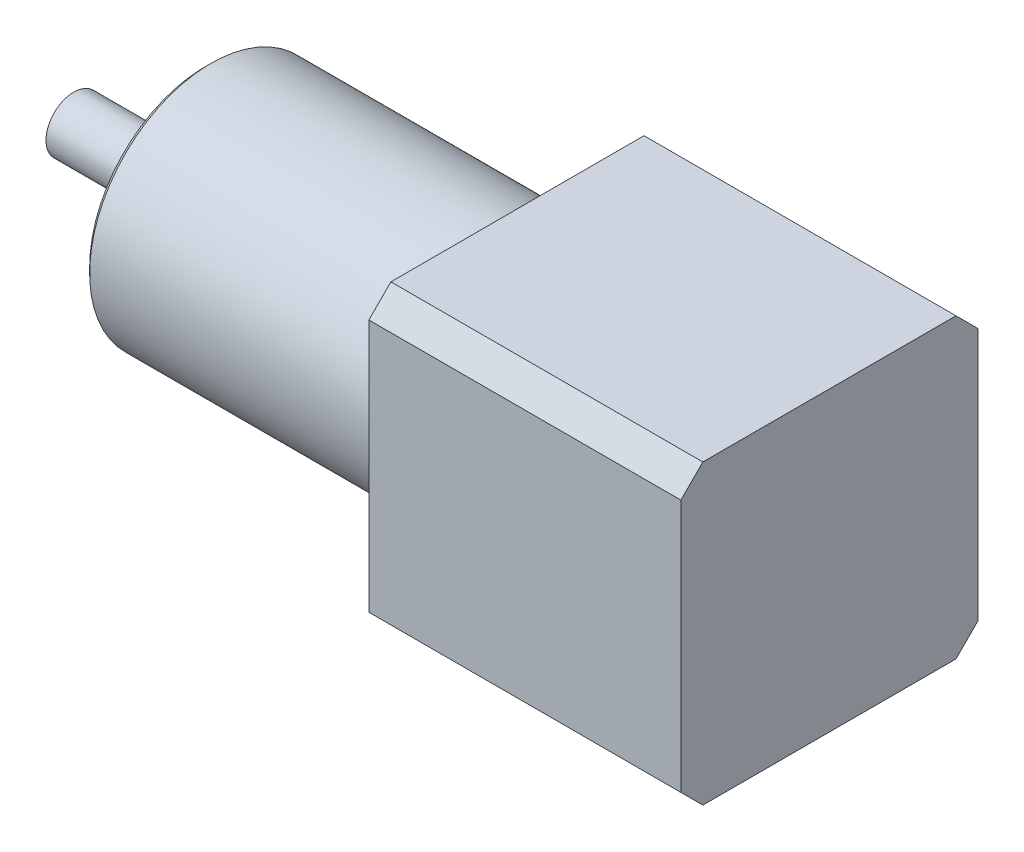
ISO-10303-21;
HEADER;
FILE_DESCRIPTION(('STEP AP214'),'2;1');
FILE_NAME('part.step','',(''),(''),'','','');
FILE_SCHEMA(('AUTOMOTIVE_DESIGN { 1 0 10303 214 1 1 1 1 }'));
ENDSEC;
DATA;
#1=APPLICATION_CONTEXT('core data for automotive mechanical design processes');
#2=APPLICATION_PROTOCOL_DEFINITION('international standard','automotive_design',2000,#1);
#3=PRODUCT_CONTEXT('',#1,'mechanical');
#4=PRODUCT('Part','Part','',(#3));
#5=PRODUCT_RELATED_PRODUCT_CATEGORY('part','',(#4));
#6=PRODUCT_DEFINITION_FORMATION('','',#4);
#7=PRODUCT_DEFINITION_CONTEXT('part definition',#1,'design');
#8=PRODUCT_DEFINITION('design','',#6,#7);
#9=PRODUCT_DEFINITION_SHAPE('','',#8);
#10=(LENGTH_UNIT() NAMED_UNIT(*) SI_UNIT(.MILLI.,.METRE.));
#11=(NAMED_UNIT(*) PLANE_ANGLE_UNIT() SI_UNIT($,.RADIAN.));
#12=(NAMED_UNIT(*) SI_UNIT($,.STERADIAN.) SOLID_ANGLE_UNIT());
#13=UNCERTAINTY_MEASURE_WITH_UNIT(LENGTH_MEASURE(1.E-05),#10,'distance_accuracy_value','');
#14=(GEOMETRIC_REPRESENTATION_CONTEXT(3) GLOBAL_UNCERTAINTY_ASSIGNED_CONTEXT((#13)) GLOBAL_UNIT_ASSIGNED_CONTEXT((#10,
#11,#12)) REPRESENTATION_CONTEXT('',''));
#15=CARTESIAN_POINT('',(0.,0.,0.));
#16=DIRECTION('',(0.,0.,1.));
#17=DIRECTION('',(1.,0.,0.));
#18=AXIS2_PLACEMENT_3D('',#15,#16,#17);
#19=CARTESIAN_POINT('',(-45.,-21.43125,-21.43125));
#20=DIRECTION('',(0.,0.,-1.));
#21=DIRECTION('',(-1.,0.,0.));
#22=AXIS2_PLACEMENT_3D('',#19,#20,#21);
#23=PLANE('',#22);
#24=DIRECTION('',(0.,1.,0.));
#25=VECTOR('',#24,1.);
#26=CARTESIAN_POINT('',(-45.,-21.43125,-21.43125));
#27=LINE('',#26,#25);
#28=CARTESIAN_POINT('',(-45.,-18.25625,-21.43125));
#29=VERTEX_POINT('',#28);
#30=CARTESIAN_POINT('',(-45.,18.25625,-21.43125));
#31=VERTEX_POINT('',#30);
#32=EDGE_CURVE('E226',#29,#31,#27,.T.);
#33=ORIENTED_EDGE('',*,*,#32,.T.);
#34=DIRECTION('',(1.,0.,0.));
#35=VECTOR('',#34,1.);
#36=CARTESIAN_POINT('',(-45.,18.25625,-21.43125));
#37=LINE('',#36,#35);
#38=CARTESIAN_POINT('',(0.,18.25625,-21.43125));
#39=VERTEX_POINT('',#38);
#40=EDGE_CURVE('E177',#31,#39,#37,.T.);
#41=ORIENTED_EDGE('',*,*,#40,.T.);
#42=DIRECTION('',(0.,1.,0.));
#43=VECTOR('',#42,1.);
#44=CARTESIAN_POINT('',(0.,-21.43125,-21.43125));
#45=LINE('',#44,#43);
#46=CARTESIAN_POINT('',(0.,-18.25625,-21.43125));
#47=VERTEX_POINT('',#46);
#48=EDGE_CURVE('E247',#47,#39,#45,.T.);
#49=ORIENTED_EDGE('',*,*,#48,.F.);
#50=DIRECTION('',(-1.,0.,0.));
#51=VECTOR('',#50,1.);
#52=CARTESIAN_POINT('',(-45.,-18.25625,-21.43125));
#53=LINE('',#52,#51);
#54=EDGE_CURVE('E174',#47,#29,#53,.T.);
#55=ORIENTED_EDGE('',*,*,#54,.T.);
#56=EDGE_LOOP('',(#33,#41,#49,#55));
#57=FACE_BOUND('',#56,.T.);
#58=ADVANCED_FACE('F41',(#57),#23,.T.);
#59=CARTESIAN_POINT('',(-45.,-21.43125,21.43125));
#60=DIRECTION('',(0.,-1.,0.));
#61=DIRECTION('',(0.,0.,-1.));
#62=AXIS2_PLACEMENT_3D('',#59,#60,#61);
#63=PLANE('',#62);
#64=DIRECTION('',(0.,0.,-1.));
#65=VECTOR('',#64,1.);
#66=CARTESIAN_POINT('',(0.,-21.43125,21.43125));
#67=LINE('',#66,#65);
#68=CARTESIAN_POINT('',(0.,-21.43125,18.25625));
#69=VERTEX_POINT('',#68);
#70=CARTESIAN_POINT('',(0.,-21.43125,-18.25625));
#71=VERTEX_POINT('',#70);
#72=EDGE_CURVE('E130',#69,#71,#67,.T.);
#73=ORIENTED_EDGE('',*,*,#72,.F.);
#74=DIRECTION('',(-1.,0.,0.));
#75=VECTOR('',#74,1.);
#76=CARTESIAN_POINT('',(-45.,-21.43125,18.25625));
#77=LINE('',#76,#75);
#78=CARTESIAN_POINT('',(-45.,-21.43125,18.25625));
#79=VERTEX_POINT('',#78);
#80=EDGE_CURVE('E155',#69,#79,#77,.T.);
#81=ORIENTED_EDGE('',*,*,#80,.T.);
#82=DIRECTION('',(0.,0.,-1.));
#83=VECTOR('',#82,1.);
#84=CARTESIAN_POINT('',(-45.,-21.43125,21.43125));
#85=LINE('',#84,#83);
#86=CARTESIAN_POINT('',(-45.,-21.43125,-18.25625));
#87=VERTEX_POINT('',#86);
#88=EDGE_CURVE('E243',#79,#87,#85,.T.);
#89=ORIENTED_EDGE('',*,*,#88,.T.);
#90=DIRECTION('',(1.,0.,0.));
#91=VECTOR('',#90,1.);
#92=CARTESIAN_POINT('',(-45.,-21.43125,-18.25625));
#93=LINE('',#92,#91);
#94=EDGE_CURVE('E151',#87,#71,#93,.T.);
#95=ORIENTED_EDGE('',*,*,#94,.T.);
#96=EDGE_LOOP('',(#73,#81,#89,#95));
#97=FACE_BOUND('',#96,.T.);
#98=ADVANCED_FACE('F197',(#97),#63,.T.);
#99=CARTESIAN_POINT('',(-45.,-21.43125,21.43125));
#100=DIRECTION('',(0.,0.,1.));
#101=DIRECTION('',(1.,0.,0.));
#102=AXIS2_PLACEMENT_3D('',#99,#100,#101);
#103=PLANE('',#102);
#104=DIRECTION('',(0.,-1.,0.));
#105=VECTOR('',#104,1.);
#106=CARTESIAN_POINT('',(-45.,-21.43125,21.43125));
#107=LINE('',#106,#105);
#108=CARTESIAN_POINT('',(-45.,18.25625,21.43125));
#109=VERTEX_POINT('',#108);
#110=CARTESIAN_POINT('',(-45.,-18.25625,21.43125));
#111=VERTEX_POINT('',#110);
#112=EDGE_CURVE('E236',#109,#111,#107,.T.);
#113=ORIENTED_EDGE('',*,*,#112,.T.);
#114=DIRECTION('',(1.,0.,0.));
#115=VECTOR('',#114,1.);
#116=CARTESIAN_POINT('',(-45.,-18.25625,21.43125));
#117=LINE('',#116,#115);
#118=CARTESIAN_POINT('',(0.,-18.25625,21.43125));
#119=VERTEX_POINT('',#118);
#120=EDGE_CURVE('E128',#111,#119,#117,.T.);
#121=ORIENTED_EDGE('',*,*,#120,.T.);
#122=DIRECTION('',(0.,-1.,0.));
#123=VECTOR('',#122,1.);
#124=CARTESIAN_POINT('',(0.,-21.43125,21.43125));
#125=LINE('',#124,#123);
#126=CARTESIAN_POINT('',(0.,18.25625,21.43125));
#127=VERTEX_POINT('',#126);
#128=EDGE_CURVE('E112',#127,#119,#125,.T.);
#129=ORIENTED_EDGE('',*,*,#128,.F.);
#130=DIRECTION('',(-1.,0.,0.));
#131=VECTOR('',#130,1.);
#132=CARTESIAN_POINT('',(-45.,18.25625,21.43125));
#133=LINE('',#132,#131);
#134=EDGE_CURVE('E126',#127,#109,#133,.T.);
#135=ORIENTED_EDGE('',*,*,#134,.T.);
#136=EDGE_LOOP('',(#113,#121,#129,#135));
#137=FACE_BOUND('',#136,.T.);
#138=ADVANCED_FACE('F125',(#137),#103,.T.);
#139=CARTESIAN_POINT('',(-45.,21.43125,21.43125));
#140=DIRECTION('',(0.,1.,0.));
#141=DIRECTION('',(0.,0.,1.));
#142=AXIS2_PLACEMENT_3D('',#139,#140,#141);
#143=PLANE('',#142);
#144=DIRECTION('',(0.,0.,1.));
#145=VECTOR('',#144,1.);
#146=CARTESIAN_POINT('',(-45.,21.43125,21.43125));
#147=LINE('',#146,#145);
#148=CARTESIAN_POINT('',(-45.,21.43125,-18.25625));
#149=VERTEX_POINT('',#148);
#150=CARTESIAN_POINT('',(-45.,21.43125,18.25625));
#151=VERTEX_POINT('',#150);
#152=EDGE_CURVE('E228',#149,#151,#147,.T.);
#153=ORIENTED_EDGE('',*,*,#152,.T.);
#154=DIRECTION('',(1.,0.,0.));
#155=VECTOR('',#154,1.);
#156=CARTESIAN_POINT('',(-45.,21.43125,18.25625));
#157=LINE('',#156,#155);
#158=CARTESIAN_POINT('',(0.,21.43125,18.25625));
#159=VERTEX_POINT('',#158);
#160=EDGE_CURVE('E171',#151,#159,#157,.T.);
#161=ORIENTED_EDGE('',*,*,#160,.T.);
#162=DIRECTION('',(0.,0.,1.));
#163=VECTOR('',#162,1.);
#164=CARTESIAN_POINT('',(0.,21.43125,21.43125));
#165=LINE('',#164,#163);
#166=CARTESIAN_POINT('',(0.,21.43125,-18.25625));
#167=VERTEX_POINT('',#166);
#168=EDGE_CURVE('E113',#167,#159,#165,.T.);
#169=ORIENTED_EDGE('',*,*,#168,.F.);
#170=DIRECTION('',(-1.,0.,0.));
#171=VECTOR('',#170,1.);
#172=CARTESIAN_POINT('',(-45.,21.43125,-18.25625));
#173=LINE('',#172,#171);
#174=EDGE_CURVE('E64',#167,#149,#173,.T.);
#175=ORIENTED_EDGE('',*,*,#174,.T.);
#176=EDGE_LOOP('',(#153,#161,#169,#175));
#177=FACE_BOUND('',#176,.T.);
#178=ADVANCED_FACE('F208',(#177),#143,.T.);
#179=CARTESIAN_POINT('',(-45.,0.,0.));
#180=DIRECTION('',(-1.,0.,0.));
#181=DIRECTION('',(0.,0.,1.));
#182=AXIS2_PLACEMENT_3D('',#179,#180,#181);
#183=PLANE('',#182);
#184=CARTESIAN_POINT('',(-45.,0.,0.));
#185=DIRECTION('',(-1.,0.,0.));
#186=DIRECTION('',(0.,0.,1.));
#187=AXIS2_PLACEMENT_3D('',#184,#185,#186);
#188=CIRCLE('',#187,17.5);
#189=CARTESIAN_POINT('',(-45.,0.,-17.5));
#190=VERTEX_POINT('',#189);
#191=EDGE_CURVE('E141',#190,#190,#188,.T.);
#192=ORIENTED_EDGE('',*,*,#191,.F.);
#193=EDGE_LOOP('',(#192));
#194=FACE_BOUND('',#193,.T.);
#195=ORIENTED_EDGE('',*,*,#88,.F.);
#196=DIRECTION('',(0.,-0.707106781186546,-0.707106781186549));
#197=VECTOR('',#196,1.);
#198=CARTESIAN_POINT('',(-45.,-19.84375,19.84375));
#199=LINE('',#198,#197);
#200=EDGE_CURVE('E166',#79,#111,#199,.F.);
#201=ORIENTED_EDGE('',*,*,#200,.T.);
#202=ORIENTED_EDGE('',*,*,#112,.F.);
#203=DIRECTION('',(0.,-0.70710678118655,0.707106781186545));
#204=VECTOR('',#203,1.);
#205=CARTESIAN_POINT('',(-45.,19.8437499999999,19.8437500000001));
#206=LINE('',#205,#204);
#207=EDGE_CURVE('E57',#109,#151,#206,.F.);
#208=ORIENTED_EDGE('',*,*,#207,.T.);
#209=ORIENTED_EDGE('',*,*,#152,.F.);
#210=DIRECTION('',(0.,0.707106781186546,0.707106781186549));
#211=VECTOR('',#210,1.);
#212=CARTESIAN_POINT('',(-45.,19.84375,-19.8437499999999));
#213=LINE('',#212,#211);
#214=EDGE_CURVE('E161',#149,#31,#213,.F.);
#215=ORIENTED_EDGE('',*,*,#214,.T.);
#216=ORIENTED_EDGE('',*,*,#32,.F.);
#217=DIRECTION('',(0.,0.707106781186548,-0.707106781186547));
#218=VECTOR('',#217,1.);
#219=CARTESIAN_POINT('',(-45.,-19.84375,-19.84375));
#220=LINE('',#219,#218);
#221=EDGE_CURVE('E158',#29,#87,#220,.F.);
#222=ORIENTED_EDGE('',*,*,#221,.T.);
#223=EDGE_LOOP('',(#195,#201,#202,#208,#209,#215,#216,#222));
#224=FACE_BOUND('',#223,.T.);
#225=ADVANCED_FACE('F225',(#194,#224),#183,.T.);
#226=CARTESIAN_POINT('',(0.,0.,0.));
#227=DIRECTION('',(-1.,0.,0.));
#228=DIRECTION('',(0.,0.,1.));
#229=AXIS2_PLACEMENT_3D('',#226,#227,#228);
#230=PLANE('',#229);
#231=ORIENTED_EDGE('',*,*,#128,.T.);
#232=DIRECTION('',(0.,0.707106781186546,0.707106781186549));
#233=VECTOR('',#232,1.);
#234=CARTESIAN_POINT('',(0.,-18.25625,21.43125));
#235=LINE('',#234,#233);
#236=EDGE_CURVE('E119',#119,#69,#235,.F.);
#237=ORIENTED_EDGE('',*,*,#236,.T.);
#238=ORIENTED_EDGE('',*,*,#72,.T.);
#239=DIRECTION('',(0.,-0.707106781186548,0.707106781186547));
#240=VECTOR('',#239,1.);
#241=CARTESIAN_POINT('',(0.,-21.43125,-18.25625));
#242=LINE('',#241,#240);
#243=EDGE_CURVE('E138',#71,#47,#242,.F.);
#244=ORIENTED_EDGE('',*,*,#243,.T.);
#245=ORIENTED_EDGE('',*,*,#48,.T.);
#246=DIRECTION('',(0.,-0.707106781186546,-0.707106781186549));
#247=VECTOR('',#246,1.);
#248=CARTESIAN_POINT('',(0.,18.25625,-21.43125));
#249=LINE('',#248,#247);
#250=EDGE_CURVE('E120',#39,#167,#249,.F.);
#251=ORIENTED_EDGE('',*,*,#250,.T.);
#252=ORIENTED_EDGE('',*,*,#168,.T.);
#253=DIRECTION('',(0.,0.70710678118655,-0.707106781186545));
#254=VECTOR('',#253,1.);
#255=CARTESIAN_POINT('',(0.,21.43125,18.25625));
#256=LINE('',#255,#254);
#257=EDGE_CURVE('E109',#159,#127,#256,.F.);
#258=ORIENTED_EDGE('',*,*,#257,.T.);
#259=EDGE_LOOP('',(#231,#237,#238,#244,#245,#251,#252,#258));
#260=FACE_BOUND('',#259,.T.);
#261=ADVANCED_FACE('F111',(#260),#230,.F.);
#262=CARTESIAN_POINT('',(-90.,0.,0.));
#263=DIRECTION('',(1.,0.,0.));
#264=DIRECTION('',(0.,0.,-1.));
#265=AXIS2_PLACEMENT_3D('',#262,#263,#264);
#266=CYLINDRICAL_SURFACE('',#265,17.5);
#267=CARTESIAN_POINT('',(-89.2062500000001,0.,0.));
#268=DIRECTION('',(-1.,0.,0.));
#269=DIRECTION('',(0.,0.,1.));
#270=AXIS2_PLACEMENT_3D('',#267,#268,#269);
#271=CIRCLE('',#270,17.5);
#272=CARTESIAN_POINT('',(-89.2062500000001,0.,-17.5));
#273=VERTEX_POINT('',#272);
#274=EDGE_CURVE('E11',#273,#273,#271,.F.);
#275=CARTESIAN_POINT('',(-89.2062500000001,0.,-17.5));
#276=CARTESIAN_POINT('',(-88.7457682291667,0.,-17.5));
#277=CARTESIAN_POINT('',(-88.2852864583334,0.,-17.5));
#278=CARTESIAN_POINT('',(-87.3643229166667,0.,-17.5));
#279=CARTESIAN_POINT('',(-86.9038411458334,0.,-17.5));
#280=CARTESIAN_POINT('',(-85.9828776041667,0.,-17.5));
#281=CARTESIAN_POINT('',(-85.5223958333334,0.,-17.5));
#282=CARTESIAN_POINT('',(-84.6014322916667,0.,-17.5));
#283=CARTESIAN_POINT('',(-84.1409505208334,0.,-17.5));
#284=CARTESIAN_POINT('',(-83.2199869791667,0.,-17.5));
#285=CARTESIAN_POINT('',(-82.7595052083334,0.,-17.5));
#286=CARTESIAN_POINT('',(-81.8385416666667,0.,-17.5));
#287=CARTESIAN_POINT('',(-81.3780598958334,0.,-17.5));
#288=CARTESIAN_POINT('',(-80.4570963541667,0.,-17.5));
#289=CARTESIAN_POINT('',(-79.9966145833334,0.,-17.5));
#290=CARTESIAN_POINT('',(-79.0756510416667,0.,-17.5));
#291=CARTESIAN_POINT('',(-78.6151692708334,0.,-17.5));
#292=CARTESIAN_POINT('',(-77.6942057291667,0.,-17.5));
#293=CARTESIAN_POINT('',(-77.2337239583334,0.,-17.5));
#294=CARTESIAN_POINT('',(-76.3127604166667,0.,-17.5));
#295=CARTESIAN_POINT('',(-75.8522786458334,0.,-17.5));
#296=CARTESIAN_POINT('',(-74.9313151041667,0.,-17.5));
#297=CARTESIAN_POINT('',(-74.4708333333334,0.,-17.5));
#298=CARTESIAN_POINT('',(-73.5498697916667,0.,-17.5));
#299=CARTESIAN_POINT('',(-73.0893880208334,0.,-17.5));
#300=CARTESIAN_POINT('',(-72.1684244791667,0.,-17.5));
#301=CARTESIAN_POINT('',(-71.7079427083334,0.,-17.5));
#302=CARTESIAN_POINT('',(-70.7869791666667,0.,-17.5));
#303=CARTESIAN_POINT('',(-70.3264973958334,0.,-17.5));
#304=CARTESIAN_POINT('',(-69.4055338541667,0.,-17.5));
#305=CARTESIAN_POINT('',(-68.9450520833334,0.,-17.5));
#306=CARTESIAN_POINT('',(-68.0240885416667,0.,-17.5));
#307=CARTESIAN_POINT('',(-67.5636067708334,0.,-17.5));
#308=CARTESIAN_POINT('',(-66.6426432291667,0.,-17.5));
#309=CARTESIAN_POINT('',(-66.1821614583333,0.,-17.5));
#310=CARTESIAN_POINT('',(-65.2611979166667,0.,-17.5));
#311=CARTESIAN_POINT('',(-64.8007161458333,0.,-17.5));
#312=CARTESIAN_POINT('',(-63.8797526041667,0.,-17.5));
#313=CARTESIAN_POINT('',(-63.4192708333333,0.,-17.5));
#314=CARTESIAN_POINT('',(-62.4983072916667,0.,-17.5));
#315=CARTESIAN_POINT('',(-62.0378255208333,0.,-17.5));
#316=CARTESIAN_POINT('',(-61.1168619791667,0.,-17.5));
#317=CARTESIAN_POINT('',(-60.6563802083333,0.,-17.5));
#318=CARTESIAN_POINT('',(-59.7354166666667,0.,-17.5));
#319=CARTESIAN_POINT('',(-59.2749348958333,0.,-17.5));
#320=CARTESIAN_POINT('',(-58.3539713541667,0.,-17.5));
#321=CARTESIAN_POINT('',(-57.8934895833333,0.,-17.5));
#322=CARTESIAN_POINT('',(-56.9725260416667,0.,-17.5));
#323=CARTESIAN_POINT('',(-56.5120442708333,0.,-17.5));
#324=CARTESIAN_POINT('',(-55.5910807291667,0.,-17.5));
#325=CARTESIAN_POINT('',(-55.1305989583333,0.,-17.5));
#326=CARTESIAN_POINT('',(-54.2096354166667,0.,-17.5));
#327=CARTESIAN_POINT('',(-53.7491536458333,0.,-17.5));
#328=CARTESIAN_POINT('',(-52.8281901041667,0.,-17.5));
#329=CARTESIAN_POINT('',(-52.3677083333333,0.,-17.5));
#330=CARTESIAN_POINT('',(-51.4467447916667,0.,-17.5));
#331=CARTESIAN_POINT('',(-50.9862630208333,0.,-17.5));
#332=CARTESIAN_POINT('',(-50.0652994791667,0.,-17.5));
#333=CARTESIAN_POINT('',(-49.6048177083333,0.,-17.5));
#334=CARTESIAN_POINT('',(-48.6838541666667,0.,-17.5));
#335=CARTESIAN_POINT('',(-48.2233723958333,0.,-17.5));
#336=CARTESIAN_POINT('',(-47.3024088541667,0.,-17.5));
#337=CARTESIAN_POINT('',(-46.8419270833333,0.,-17.5));
#338=CARTESIAN_POINT('',(-45.9209635416667,0.,-17.5));
#339=CARTESIAN_POINT('',(-45.4604817708333,0.,-17.5));
#340=CARTESIAN_POINT('',(-45.,0.,-17.5));
#341=B_SPLINE_CURVE_WITH_KNOTS('',3,(#275,#276,#277,#278,#279,#280,#281,#282,#283,#284,#285,
#286,#287,#288,#289,#290,#291,#292,#293,#294,#295,#296,#297,#298,#299,#300,#301,#302,#303,#304,
#305,#306,#307,#308,#309,#310,#311,#312,#313,#314,#315,#316,#317,#318,#319,#320,#321,#322,#323,
#324,#325,#326,#327,#328,#329,#330,#331,#332,#333,#334,#335,#336,#337,#338,#339,#340),
.UNSPECIFIED.,.F.,.F.,(4,2,2,2,2,2,2,2,2,2,2,2,2,2,2,2,2,2,2,2,2,2,2,2,2,2,2,2,2,2,2,2,4),(0.,
1.38144531250001,2.76289062500001,4.14433593750001,5.52578125000001,6.90722656250002,
8.28867187500001,9.67011718750002,11.0515625,12.4330078125,13.814453125,15.1958984375,
16.57734375,17.9587890625,19.340234375,20.7216796875,22.103125,23.4845703125,24.866015625,
26.2474609375,27.62890625,29.0103515625001,30.391796875,31.7732421875,33.1546875000001,
34.5361328125,35.917578125,37.2990234375001,38.6804687500001,40.0619140625001,41.4433593750001,
42.8248046875001,44.2062500000001),.UNSPECIFIED.);
#342=EDGE_CURVE('BSEAM264',#273,#190,#341,.T.);
#343=ORIENTED_EDGE('',*,*,#274,.T.);
#344=ORIENTED_EDGE('',*,*,#191,.T.);
#345=ORIENTED_EDGE('',*,*,#342,.T.);
#346=ORIENTED_EDGE('',*,*,#342,.F.);
#347=EDGE_LOOP('',(#343,#345,#344,#346));
#348=FACE_BOUND('',#347,.T.);
#349=ADVANCED_FACE('F264',(#348),#266,.T.);
#350=CARTESIAN_POINT('',(-90.,0.,0.));
#351=DIRECTION('',(-1.,0.,0.));
#352=DIRECTION('',(0.,0.,1.));
#353=AXIS2_PLACEMENT_3D('',#350,#351,#352);
#354=PLANE('',#353);
#355=CARTESIAN_POINT('',(-90.,0.,0.));
#356=DIRECTION('',(-1.,0.,0.));
#357=DIRECTION('',(0.,0.,1.));
#358=AXIS2_PLACEMENT_3D('',#355,#356,#357);
#359=CIRCLE('',#358,16.7062500000001);
#360=CARTESIAN_POINT('',(-90.,0.,-16.7062500000001));
#361=VERTEX_POINT('',#360);
#362=EDGE_CURVE('E50',#361,#361,#359,.T.);
#363=ORIENTED_EDGE('',*,*,#362,.T.);
#364=EDGE_LOOP('',(#363));
#365=FACE_BOUND('',#364,.T.);
#366=CARTESIAN_POINT('',(-90.,0.,0.));
#367=DIRECTION('',(-1.,0.,0.));
#368=DIRECTION('',(0.,0.,1.));
#369=AXIS2_PLACEMENT_3D('',#366,#367,#368);
#370=CIRCLE('',#369,4.);
#371=CARTESIAN_POINT('',(-90.,0.,4.));
#372=VERTEX_POINT('',#371);
#373=EDGE_CURVE('E134',#372,#372,#370,.T.);
#374=ORIENTED_EDGE('',*,*,#373,.F.);
#375=EDGE_LOOP('',(#374));
#376=FACE_BOUND('',#375,.T.);
#377=ADVANCED_FACE('F184',(#365,#376),#354,.T.);
#378=CARTESIAN_POINT('',(-109.,0.,0.));
#379=DIRECTION('',(1.,0.,0.));
#380=DIRECTION('',(0.,0.,-1.));
#381=AXIS2_PLACEMENT_3D('',#378,#379,#380);
#382=CYLINDRICAL_SURFACE('',#381,4.);
#383=CARTESIAN_POINT('',(-109.,0.,0.));
#384=DIRECTION('',(-1.,0.,0.));
#385=DIRECTION('',(0.,0.,1.));
#386=AXIS2_PLACEMENT_3D('',#383,#384,#385);
#387=CIRCLE('',#386,4.);
#388=CARTESIAN_POINT('',(-109.,0.,4.));
#389=VERTEX_POINT('',#388);
#390=EDGE_CURVE('E250',#389,#389,#387,.T.);
#391=ORIENTED_EDGE('',*,*,#390,.F.);
#392=EDGE_LOOP('',(#391));
#393=FACE_BOUND('',#392,.T.);
#394=ORIENTED_EDGE('',*,*,#373,.T.);
#395=EDGE_LOOP('',(#394));
#396=FACE_BOUND('',#395,.T.);
#397=ADVANCED_FACE('F258',(#393,#396),#382,.T.);
#398=CARTESIAN_POINT('',(-109.,0.,0.));
#399=DIRECTION('',(-1.,0.,0.));
#400=DIRECTION('',(0.,0.,1.));
#401=AXIS2_PLACEMENT_3D('',#398,#399,#400);
#402=PLANE('',#401);
#403=ORIENTED_EDGE('',*,*,#390,.T.);
#404=EDGE_LOOP('',(#403));
#405=FACE_BOUND('',#404,.T.);
#406=ADVANCED_FACE('F213',(#405),#402,.T.);
#407=CARTESIAN_POINT('',(-45.,-18.25625,21.43125));
#408=DIRECTION('',(0.,0.707106781186549,-0.707106781186546));
#409=DIRECTION('',(1.,0.,0.));
#410=AXIS2_PLACEMENT_3D('',#407,#408,#409);
#411=PLANE('',#410);
#412=ORIENTED_EDGE('',*,*,#200,.F.);
#413=ORIENTED_EDGE('',*,*,#80,.F.);
#414=ORIENTED_EDGE('',*,*,#236,.F.);
#415=ORIENTED_EDGE('',*,*,#120,.F.);
#416=EDGE_LOOP('',(#412,#413,#414,#415));
#417=FACE_BOUND('',#416,.T.);
#418=ADVANCED_FACE('F210',(#417),#411,.F.);
#419=CARTESIAN_POINT('',(-45.,21.43125,18.25625));
#420=DIRECTION('',(0.,-0.707106781186545,-0.70710678118655));
#421=DIRECTION('',(1.,0.,0.));
#422=AXIS2_PLACEMENT_3D('',#419,#420,#421);
#423=PLANE('',#422);
#424=ORIENTED_EDGE('',*,*,#207,.F.);
#425=ORIENTED_EDGE('',*,*,#134,.F.);
#426=ORIENTED_EDGE('',*,*,#257,.F.);
#427=ORIENTED_EDGE('',*,*,#160,.F.);
#428=EDGE_LOOP('',(#424,#425,#426,#427));
#429=FACE_BOUND('',#428,.T.);
#430=ADVANCED_FACE('F132',(#429),#423,.F.);
#431=CARTESIAN_POINT('',(-45.,18.25625,-21.43125));
#432=DIRECTION('',(0.,-0.707106781186549,0.707106781186546));
#433=DIRECTION('',(1.,0.,0.));
#434=AXIS2_PLACEMENT_3D('',#431,#432,#433);
#435=PLANE('',#434);
#436=ORIENTED_EDGE('',*,*,#214,.F.);
#437=ORIENTED_EDGE('',*,*,#174,.F.);
#438=ORIENTED_EDGE('',*,*,#250,.F.);
#439=ORIENTED_EDGE('',*,*,#40,.F.);
#440=EDGE_LOOP('',(#436,#437,#438,#439));
#441=FACE_BOUND('',#440,.T.);
#442=ADVANCED_FACE('F193',(#441),#435,.F.);
#443=CARTESIAN_POINT('',(-45.,-21.43125,-18.25625));
#444=DIRECTION('',(0.,0.707106781186547,0.707106781186548));
#445=DIRECTION('',(1.,0.,0.));
#446=AXIS2_PLACEMENT_3D('',#443,#444,#445);
#447=PLANE('',#446);
#448=ORIENTED_EDGE('',*,*,#221,.F.);
#449=ORIENTED_EDGE('',*,*,#54,.F.);
#450=ORIENTED_EDGE('',*,*,#243,.F.);
#451=ORIENTED_EDGE('',*,*,#94,.F.);
#452=EDGE_LOOP('',(#448,#449,#450,#451));
#453=FACE_BOUND('',#452,.T.);
#454=ADVANCED_FACE('F188',(#453),#447,.F.);
#455=CARTESIAN_POINT('',(-90.,0.,0.));
#456=DIRECTION('',(1.,0.,0.));
#457=DIRECTION('',(0.,0.,-1.));
#458=AXIS2_PLACEMENT_3D('',#455,#456,#457);
#459=CONICAL_SURFACE('',#458,16.7062500000001,0.785398163397453);
#460=CARTESIAN_POINT('',(-89.2062500000001,0.,-17.5));
#461=CARTESIAN_POINT('',(-89.2145182291667,0.,-17.4917317708333));
#462=CARTESIAN_POINT('',(-89.2227864583334,0.,-17.4834635416667));
#463=CARTESIAN_POINT('',(-89.2393229166667,0.,-17.4669270833333));
#464=CARTESIAN_POINT('',(-89.2475911458334,0.,-17.4586588541667));
#465=CARTESIAN_POINT('',(-89.2641276041667,0.,-17.4421223958334));
#466=CARTESIAN_POINT('',(-89.2723958333334,0.,-17.4338541666667));
#467=CARTESIAN_POINT('',(-89.2889322916667,0.,-17.4173177083333));
#468=CARTESIAN_POINT('',(-89.2972005208334,0.,-17.4090494791667));
#469=CARTESIAN_POINT('',(-89.3137369791667,0.,-17.3925130208334));
#470=CARTESIAN_POINT('',(-89.3220052083334,0.,-17.3842447916667));
#471=CARTESIAN_POINT('',(-89.3385416666667,0.,-17.3677083333334));
#472=CARTESIAN_POINT('',(-89.3468098958334,0.,-17.3594401041667));
#473=CARTESIAN_POINT('',(-89.3633463541667,0.,-17.3429036458334));
#474=CARTESIAN_POINT('',(-89.3716145833334,0.,-17.3346354166667));
#475=CARTESIAN_POINT('',(-89.3881510416667,0.,-17.3180989583334));
#476=CARTESIAN_POINT('',(-89.3964192708334,0.,-17.3098307291667));
#477=CARTESIAN_POINT('',(-89.4129557291667,0.,-17.2932942708334));
#478=CARTESIAN_POINT('',(-89.4212239583334,0.,-17.2850260416667));
#479=CARTESIAN_POINT('',(-89.4377604166667,0.,-17.2684895833334));
#480=CARTESIAN_POINT('',(-89.4460286458334,0.,-17.2602213541667));
#481=CARTESIAN_POINT('',(-89.4625651041667,0.,-17.2436848958334));
#482=CARTESIAN_POINT('',(-89.4708333333334,0.,-17.2354166666667));
#483=CARTESIAN_POINT('',(-89.4873697916667,0.,-17.2188802083334));
#484=CARTESIAN_POINT('',(-89.4956380208334,0.,-17.2106119791667));
#485=CARTESIAN_POINT('',(-89.5121744791667,0.,-17.1940755208334));
#486=CARTESIAN_POINT('',(-89.5204427083334,0.,-17.1858072916667));
#487=CARTESIAN_POINT('',(-89.5369791666667,0.,-17.1692708333334));
#488=CARTESIAN_POINT('',(-89.5452473958334,0.,-17.1610026041667));
#489=CARTESIAN_POINT('',(-89.5617838541667,0.,-17.1444661458334));
#490=CARTESIAN_POINT('',(-89.5700520833334,0.,-17.1361979166667));
#491=CARTESIAN_POINT('',(-89.5865885416667,0.,-17.1196614583334));
#492=CARTESIAN_POINT('',(-89.5948567708334,0.,-17.1113932291667));
#493=CARTESIAN_POINT('',(-89.6113932291667,0.,-17.0948567708334));
#494=CARTESIAN_POINT('',(-89.6196614583334,0.,-17.0865885416667));
#495=CARTESIAN_POINT('',(-89.6361979166667,0.,-17.0700520833334));
#496=CARTESIAN_POINT('',(-89.6444661458333,0.,-17.0617838541667));
#497=CARTESIAN_POINT('',(-89.6610026041667,0.,-17.0452473958334));
#498=CARTESIAN_POINT('',(-89.6692708333334,0.,-17.0369791666667));
#499=CARTESIAN_POINT('',(-89.6858072916667,0.,-17.0204427083334));
#500=CARTESIAN_POINT('',(-89.6940755208334,0.,-17.0121744791667));
#501=CARTESIAN_POINT('',(-89.7106119791667,0.,-16.9956380208334));
#502=CARTESIAN_POINT('',(-89.7188802083333,0.,-16.9873697916667));
#503=CARTESIAN_POINT('',(-89.7354166666667,0.,-16.9708333333334));
#504=CARTESIAN_POINT('',(-89.7436848958333,0.,-16.9625651041667));
#505=CARTESIAN_POINT('',(-89.7602213541667,0.,-16.9460286458334));
#506=CARTESIAN_POINT('',(-89.7684895833333,0.,-16.9377604166667));
#507=CARTESIAN_POINT('',(-89.7850260416667,0.,-16.9212239583334));
#508=CARTESIAN_POINT('',(-89.7932942708333,0.,-16.9129557291667));
#509=CARTESIAN_POINT('',(-89.8098307291667,0.,-16.8964192708334));
#510=CARTESIAN_POINT('',(-89.8180989583333,0.,-16.8881510416667));
#511=CARTESIAN_POINT('',(-89.8346354166667,0.,-16.8716145833334));
#512=CARTESIAN_POINT('',(-89.8429036458333,0.,-16.8633463541667));
#513=CARTESIAN_POINT('',(-89.8594401041667,0.,-16.8468098958334));
#514=CARTESIAN_POINT('',(-89.8677083333333,0.,-16.8385416666667));
#515=CARTESIAN_POINT('',(-89.8842447916667,0.,-16.8220052083334));
#516=CARTESIAN_POINT('',(-89.8925130208333,0.,-16.8137369791667));
#517=CARTESIAN_POINT('',(-89.9090494791667,0.,-16.7972005208334));
#518=CARTESIAN_POINT('',(-89.9173177083333,0.,-16.7889322916667));
#519=CARTESIAN_POINT('',(-89.9338541666667,0.,-16.7723958333334));
#520=CARTESIAN_POINT('',(-89.9421223958333,0.,-16.7641276041667));
#521=CARTESIAN_POINT('',(-89.9586588541667,0.,-16.7475911458334));
#522=CARTESIAN_POINT('',(-89.9669270833333,0.,-16.7393229166667));
#523=CARTESIAN_POINT('',(-89.9834635416667,0.,-16.7227864583334));
#524=CARTESIAN_POINT('',(-89.9917317708333,0.,-16.7145182291667));
#525=CARTESIAN_POINT('',(-90.,0.,-16.7062500000001));
#526=B_SPLINE_CURVE_WITH_KNOTS('',3,(#460,#461,#462,#463,#464,#465,#466,#467,#468,#469,#470,
#471,#472,#473,#474,#475,#476,#477,#478,#479,#480,#481,#482,#483,#484,#485,#486,#487,#488,#489,
#490,#491,#492,#493,#494,#495,#496,#497,#498,#499,#500,#501,#502,#503,#504,#505,#506,#507,#508,
#509,#510,#511,#512,#513,#514,#515,#516,#517,#518,#519,#520,#521,#522,#523,#524,#525),
.UNSPECIFIED.,.F.,.F.,(4,2,2,2,2,2,2,2,2,2,2,2,2,2,2,2,2,2,2,2,2,2,2,2,2,2,2,2,2,2,2,2,4),(0.,
0.0350791254729182,0.0701582509458463,0.105237376418767,0.140316501891695,0.175395627364613,
0.210474752837541,0.245553878310459,0.280633003783387,0.315712129256308,0.350791254729236,
0.385870380202154,0.420949505675082,0.456028631148001,0.491107756620931,0.526186882093849,
0.561266007566777,0.596345133039705,0.631424258512624,0.666503383985554,0.701582509458472,
0.736661634931401,0.771740760404319,0.806819885877247,0.841899011350165,0.876978136823096,
0.912057262296014,0.947136387768942,0.98221551324186,1.01729463871479,1.05237376418771,
1.08745288966064,1.12253201513356),.UNSPECIFIED.);
#527=EDGE_CURVE('BSEAM43',#273,#361,#526,.T.);
#528=ORIENTED_EDGE('',*,*,#274,.F.);
#529=ORIENTED_EDGE('',*,*,#362,.F.);
#530=ORIENTED_EDGE('',*,*,#527,.T.);
#531=ORIENTED_EDGE('',*,*,#527,.F.);
#532=EDGE_LOOP('',(#528,#530,#529,#531));
#533=FACE_BOUND('',#532,.T.);
#534=ADVANCED_FACE('F43',(#533),#459,.T.);
#535=CLOSED_SHELL('',(#58,#98,#138,#178,#225,#261,#349,#377,#397,#406,#418,#430,#442,#454,#534));
#536=MANIFOLD_SOLID_BREP('B2',#535);
#537=ADVANCED_BREP_SHAPE_REPRESENTATION('',(#18,#536),#14);
#538=SHAPE_DEFINITION_REPRESENTATION(#9,#537);
ENDSEC;
END-ISO-10303-21;
